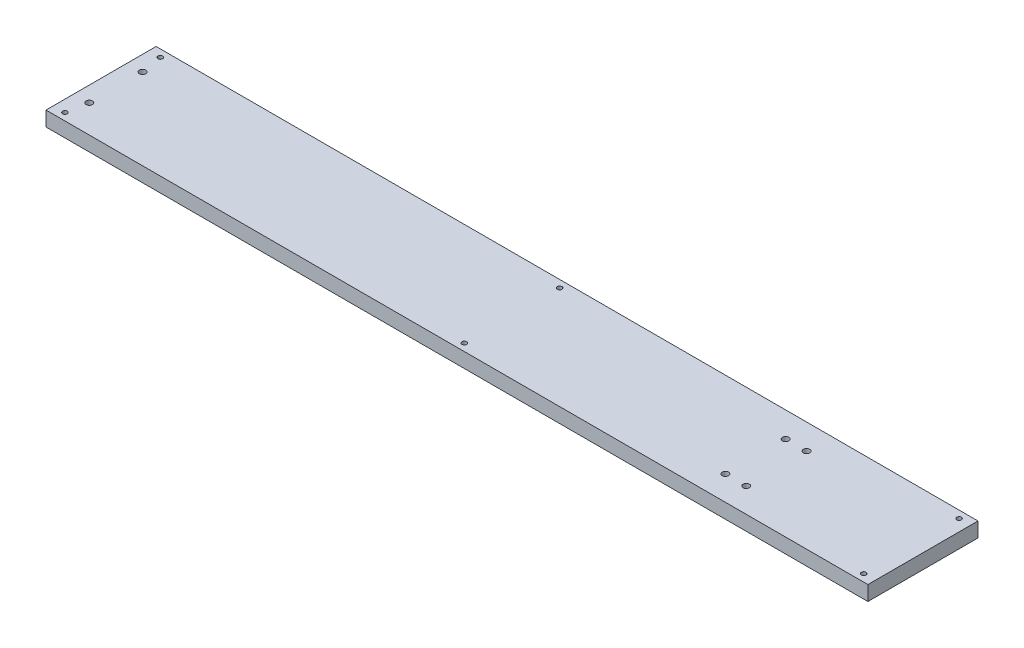
ISO-10303-21;
HEADER;
FILE_DESCRIPTION(('STEP AP214'),'2;1');
FILE_NAME('part.step','',(''),(''),'','','');
FILE_SCHEMA(('AUTOMOTIVE_DESIGN { 1 0 10303 214 1 1 1 1 }'));
ENDSEC;
DATA;
#1=APPLICATION_CONTEXT('core data for automotive mechanical design processes');
#2=APPLICATION_PROTOCOL_DEFINITION('international standard','automotive_design',2000,#1);
#3=PRODUCT_CONTEXT('',#1,'mechanical');
#4=PRODUCT('Part','Part','',(#3));
#5=PRODUCT_RELATED_PRODUCT_CATEGORY('part','',(#4));
#6=PRODUCT_DEFINITION_FORMATION('','',#4);
#7=PRODUCT_DEFINITION_CONTEXT('part definition',#1,'design');
#8=PRODUCT_DEFINITION('design','',#6,#7);
#9=PRODUCT_DEFINITION_SHAPE('','',#8);
#10=(LENGTH_UNIT() NAMED_UNIT(*) SI_UNIT(.MILLI.,.METRE.));
#11=(NAMED_UNIT(*) PLANE_ANGLE_UNIT() SI_UNIT($,.RADIAN.));
#12=(NAMED_UNIT(*) SI_UNIT($,.STERADIAN.) SOLID_ANGLE_UNIT());
#13=UNCERTAINTY_MEASURE_WITH_UNIT(LENGTH_MEASURE(1.E-05),#10,'distance_accuracy_value','');
#14=(GEOMETRIC_REPRESENTATION_CONTEXT(3) GLOBAL_UNCERTAINTY_ASSIGNED_CONTEXT((#13)) GLOBAL_UNIT_ASSIGNED_CONTEXT((#10,
#11,#12)) REPRESENTATION_CONTEXT('',''));
#15=CARTESIAN_POINT('',(0.,0.,0.));
#16=DIRECTION('',(0.,0.,1.));
#17=DIRECTION('',(1.,0.,0.));
#18=AXIS2_PLACEMENT_3D('',#15,#16,#17);
#19=CARTESIAN_POINT('',(0.,12.7,0.));
#20=DIRECTION('',(1.,0.,0.));
#21=DIRECTION('',(0.,0.,-1.));
#22=AXIS2_PLACEMENT_3D('',#19,#20,#21);
#23=PLANE('',#22);
#24=DIRECTION('',(0.,0.,1.));
#25=VECTOR('',#24,1.);
#26=CARTESIAN_POINT('',(0.,0.,0.));
#27=LINE('',#26,#25);
#28=CARTESIAN_POINT('',(0.,0.,-95.));
#29=VERTEX_POINT('',#28);
#30=CARTESIAN_POINT('',(0.,0.,0.));
#31=VERTEX_POINT('',#30);
#32=EDGE_CURVE('E112',#29,#31,#27,.T.);
#33=ORIENTED_EDGE('',*,*,#32,.T.);
#34=DIRECTION('',(0.,-1.,0.));
#35=VECTOR('',#34,1.);
#36=CARTESIAN_POINT('',(0.,12.7,0.));
#37=LINE('',#36,#35);
#38=CARTESIAN_POINT('',(0.,12.7,0.));
#39=VERTEX_POINT('',#38);
#40=EDGE_CURVE('E11',#39,#31,#37,.T.);
#41=ORIENTED_EDGE('',*,*,#40,.F.);
#42=DIRECTION('',(0.,0.,1.));
#43=VECTOR('',#42,1.);
#44=CARTESIAN_POINT('',(0.,12.7,0.));
#45=LINE('',#44,#43);
#46=CARTESIAN_POINT('',(0.,12.7,-95.));
#47=VERTEX_POINT('',#46);
#48=EDGE_CURVE('E96',#47,#39,#45,.T.);
#49=ORIENTED_EDGE('',*,*,#48,.F.);
#50=DIRECTION('',(0.,-1.,0.));
#51=VECTOR('',#50,1.);
#52=CARTESIAN_POINT('',(0.,12.7,-95.));
#53=LINE('',#52,#51);
#54=EDGE_CURVE('E108',#47,#29,#53,.T.);
#55=ORIENTED_EDGE('',*,*,#54,.T.);
#56=EDGE_LOOP('',(#33,#41,#49,#55));
#57=FACE_BOUND('',#56,.T.);
#58=ADVANCED_FACE('F44',(#57),#23,.F.);
#59=CARTESIAN_POINT('',(0.,12.7,0.));
#60=DIRECTION('',(0.,0.,-1.));
#61=DIRECTION('',(-1.,0.,0.));
#62=AXIS2_PLACEMENT_3D('',#59,#60,#61);
#63=PLANE('',#62);
#64=DIRECTION('',(1.,0.,0.));
#65=VECTOR('',#64,1.);
#66=CARTESIAN_POINT('',(0.,0.,0.));
#67=LINE('',#66,#65);
#68=CARTESIAN_POINT('',(709.,0.,0.));
#69=VERTEX_POINT('',#68);
#70=EDGE_CURVE('E101',#31,#69,#67,.T.);
#71=ORIENTED_EDGE('',*,*,#70,.T.);
#72=DIRECTION('',(0.,-1.,0.));
#73=VECTOR('',#72,1.);
#74=CARTESIAN_POINT('',(709.,12.7,0.));
#75=LINE('',#74,#73);
#76=CARTESIAN_POINT('',(709.,12.7,0.));
#77=VERTEX_POINT('',#76);
#78=EDGE_CURVE('E53',#77,#69,#75,.T.);
#79=ORIENTED_EDGE('',*,*,#78,.F.);
#80=DIRECTION('',(1.,0.,0.));
#81=VECTOR('',#80,1.);
#82=CARTESIAN_POINT('',(0.,12.7,0.));
#83=LINE('',#82,#81);
#84=EDGE_CURVE('E91',#39,#77,#83,.T.);
#85=ORIENTED_EDGE('',*,*,#84,.F.);
#86=ORIENTED_EDGE('',*,*,#40,.T.);
#87=EDGE_LOOP('',(#71,#79,#85,#86));
#88=FACE_BOUND('',#87,.T.);
#89=ADVANCED_FACE('F100',(#88),#63,.F.);
#90=CARTESIAN_POINT('',(709.,12.7,0.));
#91=DIRECTION('',(-1.,0.,0.));
#92=DIRECTION('',(0.,0.,1.));
#93=AXIS2_PLACEMENT_3D('',#90,#91,#92);
#94=PLANE('',#93);
#95=DIRECTION('',(0.,0.,-1.));
#96=VECTOR('',#95,1.);
#97=CARTESIAN_POINT('',(709.,0.,0.));
#98=LINE('',#97,#96);
#99=CARTESIAN_POINT('',(709.,0.,-95.));
#100=VERTEX_POINT('',#99);
#101=EDGE_CURVE('E78',#69,#100,#98,.T.);
#102=ORIENTED_EDGE('',*,*,#101,.T.);
#103=DIRECTION('',(0.,-1.,0.));
#104=VECTOR('',#103,1.);
#105=CARTESIAN_POINT('',(709.,12.7,-95.));
#106=LINE('',#105,#104);
#107=CARTESIAN_POINT('',(709.,12.7,-95.));
#108=VERTEX_POINT('',#107);
#109=EDGE_CURVE('E103',#108,#100,#106,.T.);
#110=ORIENTED_EDGE('',*,*,#109,.F.);
#111=DIRECTION('',(0.,0.,-1.));
#112=VECTOR('',#111,1.);
#113=CARTESIAN_POINT('',(709.,12.7,0.));
#114=LINE('',#113,#112);
#115=EDGE_CURVE('E94',#77,#108,#114,.T.);
#116=ORIENTED_EDGE('',*,*,#115,.F.);
#117=ORIENTED_EDGE('',*,*,#78,.T.);
#118=EDGE_LOOP('',(#102,#110,#116,#117));
#119=FACE_BOUND('',#118,.T.);
#120=ADVANCED_FACE('F104',(#119),#94,.F.);
#121=CARTESIAN_POINT('',(0.,12.7,-95.));
#122=DIRECTION('',(0.,0.,1.));
#123=DIRECTION('',(1.,0.,0.));
#124=AXIS2_PLACEMENT_3D('',#121,#122,#123);
#125=PLANE('',#124);
#126=DIRECTION('',(-1.,0.,0.));
#127=VECTOR('',#126,1.);
#128=CARTESIAN_POINT('',(0.,0.,-95.));
#129=LINE('',#128,#127);
#130=EDGE_CURVE('E84',#100,#29,#129,.T.);
#131=ORIENTED_EDGE('',*,*,#130,.T.);
#132=ORIENTED_EDGE('',*,*,#54,.F.);
#133=DIRECTION('',(-1.,0.,0.));
#134=VECTOR('',#133,1.);
#135=CARTESIAN_POINT('',(0.,12.7,-95.));
#136=LINE('',#135,#134);
#137=EDGE_CURVE('E61',#108,#47,#136,.T.);
#138=ORIENTED_EDGE('',*,*,#137,.F.);
#139=ORIENTED_EDGE('',*,*,#109,.T.);
#140=EDGE_LOOP('',(#131,#132,#138,#139));
#141=FACE_BOUND('',#140,.T.);
#142=ADVANCED_FACE('F126',(#141),#125,.F.);
#143=CARTESIAN_POINT('',(0.,12.7,0.));
#144=DIRECTION('',(0.,-1.,0.));
#145=DIRECTION('',(0.,0.,-1.));
#146=AXIS2_PLACEMENT_3D('',#143,#144,#145);
#147=PLANE('',#146);
#148=CARTESIAN_POINT('',(13.208,12.7,-24.13));
#149=DIRECTION('',(0.,-1.,0.));
#150=DIRECTION('',(0.,0.,-1.));
#151=AXIS2_PLACEMENT_3D('',#148,#149,#150);
#152=CIRCLE('',#151,2.75);
#153=CARTESIAN_POINT('',(13.208,12.7,-26.88));
#154=VERTEX_POINT('',#153);
#155=EDGE_CURVE('E194',#154,#154,#152,.T.);
#156=ORIENTED_EDGE('',*,*,#155,.T.);
#157=EDGE_LOOP('',(#156));
#158=FACE_BOUND('',#157,.T.);
#159=CARTESIAN_POINT('',(13.208,12.7,-70.108));
#160=DIRECTION('',(0.,-1.,0.));
#161=DIRECTION('',(0.,0.,-1.));
#162=AXIS2_PLACEMENT_3D('',#159,#160,#161);
#163=CIRCLE('',#162,2.75);
#164=CARTESIAN_POINT('',(13.208,12.7,-72.858));
#165=VERTEX_POINT('',#164);
#166=EDGE_CURVE('E213',#165,#165,#163,.T.);
#167=ORIENTED_EDGE('',*,*,#166,.T.);
#168=EDGE_LOOP('',(#167));
#169=FACE_BOUND('',#168,.T.);
#170=CARTESIAN_POINT('',(582.856967805999,12.7,-73.2158));
#171=DIRECTION('',(0.,-1.,0.));
#172=DIRECTION('',(0.,0.,-1.));
#173=AXIS2_PLACEMENT_3D('',#170,#171,#172);
#174=CIRCLE('',#173,2.75000000000004);
#175=CARTESIAN_POINT('',(582.856967805999,12.7,-75.9658));
#176=VERTEX_POINT('',#175);
#177=EDGE_CURVE('E189',#176,#176,#174,.T.);
#178=ORIENTED_EDGE('',*,*,#177,.T.);
#179=EDGE_LOOP('',(#178));
#180=FACE_BOUND('',#179,.T.);
#181=CARTESIAN_POINT('',(564.856967805999,12.7,-73.2158000000014));
#182=DIRECTION('',(0.,-1.,0.));
#183=DIRECTION('',(0.,0.,-1.));
#184=AXIS2_PLACEMENT_3D('',#181,#182,#183);
#185=CIRCLE('',#184,2.75000000000004);
#186=CARTESIAN_POINT('',(564.856967805999,12.7,-75.9658000000014));
#187=VERTEX_POINT('',#186);
#188=EDGE_CURVE('E198',#187,#187,#185,.T.);
#189=ORIENTED_EDGE('',*,*,#188,.T.);
#190=EDGE_LOOP('',(#189));
#191=FACE_BOUND('',#190,.T.);
#192=CARTESIAN_POINT('',(564.856967805994,12.7,-21.2158000000001));
#193=DIRECTION('',(0.,-1.,0.));
#194=DIRECTION('',(0.,0.,-1.));
#195=AXIS2_PLACEMENT_3D('',#192,#193,#194);
#196=CIRCLE('',#195,2.75000000000004);
#197=CARTESIAN_POINT('',(564.856967805994,12.7,-23.9658000000002));
#198=VERTEX_POINT('',#197);
#199=EDGE_CURVE('E206',#198,#198,#196,.T.);
#200=ORIENTED_EDGE('',*,*,#199,.T.);
#201=EDGE_LOOP('',(#200));
#202=FACE_BOUND('',#201,.T.);
#203=CARTESIAN_POINT('',(582.856967805994,12.7,-21.2158));
#204=DIRECTION('',(0.,-1.,0.));
#205=DIRECTION('',(0.,0.,-1.));
#206=AXIS2_PLACEMENT_3D('',#203,#204,#205);
#207=CIRCLE('',#206,2.75000000000004);
#208=CARTESIAN_POINT('',(582.856967805994,12.7,-23.9658));
#209=VERTEX_POINT('',#208);
#210=EDGE_CURVE('E146',#209,#209,#207,.T.);
#211=ORIENTED_EDGE('',*,*,#210,.T.);
#212=EDGE_LOOP('',(#211));
#213=FACE_BOUND('',#212,.T.);
#214=CARTESIAN_POINT('',(10.,12.7,-6.35));
#215=DIRECTION('',(0.,-1.,0.));
#216=DIRECTION('',(0.,0.,-1.));
#217=AXIS2_PLACEMENT_3D('',#214,#215,#216);
#218=CIRCLE('',#217,2.01949999999999);
#219=CARTESIAN_POINT('',(10.,12.7,-8.36949999999999));
#220=VERTEX_POINT('',#219);
#221=EDGE_CURVE('E141',#220,#220,#218,.T.);
#222=ORIENTED_EDGE('',*,*,#221,.T.);
#223=EDGE_LOOP('',(#222));
#224=FACE_BOUND('',#223,.T.);
#225=CARTESIAN_POINT('',(354.5,12.7,-6.35));
#226=DIRECTION('',(0.,-1.,0.));
#227=DIRECTION('',(0.,0.,-1.));
#228=AXIS2_PLACEMENT_3D('',#225,#226,#227);
#229=CIRCLE('',#228,2.01950000000003);
#230=CARTESIAN_POINT('',(354.5,12.7,-8.36950000000003));
#231=VERTEX_POINT('',#230);
#232=EDGE_CURVE('E150',#231,#231,#229,.T.);
#233=ORIENTED_EDGE('',*,*,#232,.T.);
#234=EDGE_LOOP('',(#233));
#235=FACE_BOUND('',#234,.T.);
#236=CARTESIAN_POINT('',(699.,12.7,-6.35));
#237=DIRECTION('',(0.,-1.,0.));
#238=DIRECTION('',(0.,0.,-1.));
#239=AXIS2_PLACEMENT_3D('',#236,#237,#238);
#240=CIRCLE('',#239,2.01949999999992);
#241=CARTESIAN_POINT('',(699.,12.7,-8.36949999999992));
#242=VERTEX_POINT('',#241);
#243=EDGE_CURVE('E158',#242,#242,#240,.T.);
#244=ORIENTED_EDGE('',*,*,#243,.T.);
#245=EDGE_LOOP('',(#244));
#246=FACE_BOUND('',#245,.T.);
#247=CARTESIAN_POINT('',(699.,12.7,-88.65));
#248=DIRECTION('',(0.,-1.,0.));
#249=DIRECTION('',(0.,0.,-1.));
#250=AXIS2_PLACEMENT_3D('',#247,#248,#249);
#251=CIRCLE('',#250,2.01949999999992);
#252=CARTESIAN_POINT('',(699.,12.7,-90.6694999999999));
#253=VERTEX_POINT('',#252);
#254=EDGE_CURVE('E166',#253,#253,#251,.T.);
#255=ORIENTED_EDGE('',*,*,#254,.T.);
#256=EDGE_LOOP('',(#255));
#257=FACE_BOUND('',#256,.T.);
#258=CARTESIAN_POINT('',(354.5,12.7,-88.65));
#259=DIRECTION('',(0.,-1.,0.));
#260=DIRECTION('',(0.,0.,-1.));
#261=AXIS2_PLACEMENT_3D('',#258,#259,#260);
#262=CIRCLE('',#261,2.01950000000003);
#263=CARTESIAN_POINT('',(354.5,12.7,-90.6695000000001));
#264=VERTEX_POINT('',#263);
#265=EDGE_CURVE('E174',#264,#264,#262,.T.);
#266=ORIENTED_EDGE('',*,*,#265,.T.);
#267=EDGE_LOOP('',(#266));
#268=FACE_BOUND('',#267,.T.);
#269=CARTESIAN_POINT('',(10.,12.7,-88.6500000000001));
#270=DIRECTION('',(0.,-1.,0.));
#271=DIRECTION('',(0.,0.,-1.));
#272=AXIS2_PLACEMENT_3D('',#269,#270,#271);
#273=CIRCLE('',#272,2.0195);
#274=CARTESIAN_POINT('',(10.,12.7,-90.6695000000001));
#275=VERTEX_POINT('',#274);
#276=EDGE_CURVE('E116',#275,#275,#273,.T.);
#277=ORIENTED_EDGE('',*,*,#276,.T.);
#278=EDGE_LOOP('',(#277));
#279=FACE_BOUND('',#278,.T.);
#280=ORIENTED_EDGE('',*,*,#48,.T.);
#281=ORIENTED_EDGE('',*,*,#84,.T.);
#282=ORIENTED_EDGE('',*,*,#115,.T.);
#283=ORIENTED_EDGE('',*,*,#137,.T.);
#284=EDGE_LOOP('',(#280,#281,#282,#283));
#285=FACE_BOUND('',#284,.T.);
#286=ADVANCED_FACE('F92',(#158,#169,#180,#191,#202,#213,#224,#235,#246,#257,#268,#279,#285),
#147,.F.);
#287=CARTESIAN_POINT('',(0.,0.,0.));
#288=DIRECTION('',(0.,-1.,0.));
#289=DIRECTION('',(0.,0.,-1.));
#290=AXIS2_PLACEMENT_3D('',#287,#288,#289);
#291=PLANE('',#290);
#292=CARTESIAN_POINT('',(13.208,0.,-24.13));
#293=DIRECTION('',(0.,-1.,0.));
#294=DIRECTION('',(0.,0.,-1.));
#295=AXIS2_PLACEMENT_3D('',#292,#293,#294);
#296=CIRCLE('',#295,2.75);
#297=CARTESIAN_POINT('',(13.208,0.,-26.88));
#298=VERTEX_POINT('',#297);
#299=EDGE_CURVE('E221',#298,#298,#296,.T.);
#300=ORIENTED_EDGE('',*,*,#299,.F.);
#301=EDGE_LOOP('',(#300));
#302=FACE_BOUND('',#301,.T.);
#303=CARTESIAN_POINT('',(13.208,0.,-70.108));
#304=DIRECTION('',(0.,-1.,0.));
#305=DIRECTION('',(0.,0.,-1.));
#306=AXIS2_PLACEMENT_3D('',#303,#304,#305);
#307=CIRCLE('',#306,2.75);
#308=CARTESIAN_POINT('',(13.208,0.,-72.858));
#309=VERTEX_POINT('',#308);
#310=EDGE_CURVE('E217',#309,#309,#307,.T.);
#311=ORIENTED_EDGE('',*,*,#310,.F.);
#312=EDGE_LOOP('',(#311));
#313=FACE_BOUND('',#312,.T.);
#314=CARTESIAN_POINT('',(582.856967805999,0.,-73.2158));
#315=DIRECTION('',(0.,-1.,0.));
#316=DIRECTION('',(0.,0.,-1.));
#317=AXIS2_PLACEMENT_3D('',#314,#315,#316);
#318=CIRCLE('',#317,2.75000000000004);
#319=CARTESIAN_POINT('',(582.856967805999,0.,-75.9658));
#320=VERTEX_POINT('',#319);
#321=EDGE_CURVE('E193',#320,#320,#318,.T.);
#322=ORIENTED_EDGE('',*,*,#321,.F.);
#323=EDGE_LOOP('',(#322));
#324=FACE_BOUND('',#323,.T.);
#325=CARTESIAN_POINT('',(564.856967805999,0.,-73.2158000000014));
#326=DIRECTION('',(0.,-1.,0.));
#327=DIRECTION('',(0.,0.,-1.));
#328=AXIS2_PLACEMENT_3D('',#325,#326,#327);
#329=CIRCLE('',#328,2.75000000000004);
#330=CARTESIAN_POINT('',(564.856967805999,0.,-75.9658000000014));
#331=VERTEX_POINT('',#330);
#332=EDGE_CURVE('E202',#331,#331,#329,.T.);
#333=ORIENTED_EDGE('',*,*,#332,.F.);
#334=EDGE_LOOP('',(#333));
#335=FACE_BOUND('',#334,.T.);
#336=CARTESIAN_POINT('',(564.856967805994,0.,-21.2158000000001));
#337=DIRECTION('',(0.,-1.,0.));
#338=DIRECTION('',(0.,0.,-1.));
#339=AXIS2_PLACEMENT_3D('',#336,#337,#338);
#340=CIRCLE('',#339,2.75000000000004);
#341=CARTESIAN_POINT('',(564.856967805994,0.,-23.9658000000002));
#342=VERTEX_POINT('',#341);
#343=EDGE_CURVE('E185',#342,#342,#340,.T.);
#344=ORIENTED_EDGE('',*,*,#343,.F.);
#345=EDGE_LOOP('',(#344));
#346=FACE_BOUND('',#345,.T.);
#347=CARTESIAN_POINT('',(582.856967805994,0.,-21.2158));
#348=DIRECTION('',(0.,-1.,0.));
#349=DIRECTION('',(0.,0.,-1.));
#350=AXIS2_PLACEMENT_3D('',#347,#348,#349);
#351=CIRCLE('',#350,2.75000000000004);
#352=CARTESIAN_POINT('',(582.856967805994,0.,-23.9658));
#353=VERTEX_POINT('',#352);
#354=EDGE_CURVE('E181',#353,#353,#351,.T.);
#355=ORIENTED_EDGE('',*,*,#354,.F.);
#356=EDGE_LOOP('',(#355));
#357=FACE_BOUND('',#356,.T.);
#358=CARTESIAN_POINT('',(10.,0.,-6.35));
#359=DIRECTION('',(0.,-1.,0.));
#360=DIRECTION('',(0.,0.,-1.));
#361=AXIS2_PLACEMENT_3D('',#358,#359,#360);
#362=CIRCLE('',#361,2.01949999999999);
#363=CARTESIAN_POINT('',(10.,0.,-8.36949999999999));
#364=VERTEX_POINT('',#363);
#365=EDGE_CURVE('E145',#364,#364,#362,.T.);
#366=ORIENTED_EDGE('',*,*,#365,.F.);
#367=EDGE_LOOP('',(#366));
#368=FACE_BOUND('',#367,.T.);
#369=CARTESIAN_POINT('',(354.5,0.,-6.35));
#370=DIRECTION('',(0.,-1.,0.));
#371=DIRECTION('',(0.,0.,-1.));
#372=AXIS2_PLACEMENT_3D('',#369,#370,#371);
#373=CIRCLE('',#372,2.01950000000003);
#374=CARTESIAN_POINT('',(354.5,0.,-8.36950000000003));
#375=VERTEX_POINT('',#374);
#376=EDGE_CURVE('E154',#375,#375,#373,.T.);
#377=ORIENTED_EDGE('',*,*,#376,.F.);
#378=EDGE_LOOP('',(#377));
#379=FACE_BOUND('',#378,.T.);
#380=CARTESIAN_POINT('',(699.,0.,-6.35));
#381=DIRECTION('',(0.,-1.,0.));
#382=DIRECTION('',(0.,0.,-1.));
#383=AXIS2_PLACEMENT_3D('',#380,#381,#382);
#384=CIRCLE('',#383,2.01949999999992);
#385=CARTESIAN_POINT('',(699.,0.,-8.36949999999992));
#386=VERTEX_POINT('',#385);
#387=EDGE_CURVE('E162',#386,#386,#384,.T.);
#388=ORIENTED_EDGE('',*,*,#387,.F.);
#389=EDGE_LOOP('',(#388));
#390=FACE_BOUND('',#389,.T.);
#391=CARTESIAN_POINT('',(699.,0.,-88.65));
#392=DIRECTION('',(0.,-1.,0.));
#393=DIRECTION('',(0.,0.,-1.));
#394=AXIS2_PLACEMENT_3D('',#391,#392,#393);
#395=CIRCLE('',#394,2.01949999999992);
#396=CARTESIAN_POINT('',(699.,0.,-90.6694999999999));
#397=VERTEX_POINT('',#396);
#398=EDGE_CURVE('E170',#397,#397,#395,.T.);
#399=ORIENTED_EDGE('',*,*,#398,.F.);
#400=EDGE_LOOP('',(#399));
#401=FACE_BOUND('',#400,.T.);
#402=CARTESIAN_POINT('',(354.5,0.,-88.65));
#403=DIRECTION('',(0.,-1.,0.));
#404=DIRECTION('',(0.,0.,-1.));
#405=AXIS2_PLACEMENT_3D('',#402,#403,#404);
#406=CIRCLE('',#405,2.01950000000003);
#407=CARTESIAN_POINT('',(354.5,0.,-90.6695000000001));
#408=VERTEX_POINT('',#407);
#409=EDGE_CURVE('E137',#408,#408,#406,.T.);
#410=ORIENTED_EDGE('',*,*,#409,.F.);
#411=EDGE_LOOP('',(#410));
#412=FACE_BOUND('',#411,.T.);
#413=CARTESIAN_POINT('',(10.,0.,-88.6500000000001));
#414=DIRECTION('',(0.,-1.,0.));
#415=DIRECTION('',(0.,0.,-1.));
#416=AXIS2_PLACEMENT_3D('',#413,#414,#415);
#417=CIRCLE('',#416,2.0195);
#418=CARTESIAN_POINT('',(10.,0.,-90.6695000000001));
#419=VERTEX_POINT('',#418);
#420=EDGE_CURVE('E133',#419,#419,#417,.T.);
#421=ORIENTED_EDGE('',*,*,#420,.F.);
#422=EDGE_LOOP('',(#421));
#423=FACE_BOUND('',#422,.T.);
#424=ORIENTED_EDGE('',*,*,#32,.F.);
#425=ORIENTED_EDGE('',*,*,#130,.F.);
#426=ORIENTED_EDGE('',*,*,#101,.F.);
#427=ORIENTED_EDGE('',*,*,#70,.F.);
#428=EDGE_LOOP('',(#424,#425,#426,#427));
#429=FACE_BOUND('',#428,.T.);
#430=ADVANCED_FACE('F129',(#302,#313,#324,#335,#346,#357,#368,#379,#390,#401,#412,#423,#429),
#291,.T.);
#431=CARTESIAN_POINT('',(10.,12.7,-88.6500000000001));
#432=DIRECTION('',(0.,-1.,0.));
#433=DIRECTION('',(0.,0.,-1.));
#434=AXIS2_PLACEMENT_3D('',#431,#432,#433);
#435=CYLINDRICAL_SURFACE('',#434,2.0195);
#436=ORIENTED_EDGE('',*,*,#276,.F.);
#437=EDGE_LOOP('',(#436));
#438=FACE_BOUND('',#437,.T.);
#439=ORIENTED_EDGE('',*,*,#420,.T.);
#440=EDGE_LOOP('',(#439));
#441=FACE_BOUND('',#440,.T.);
#442=ADVANCED_FACE('F240',(#438,#441),#435,.F.);
#443=CARTESIAN_POINT('',(354.5,12.7,-88.65));
#444=DIRECTION('',(0.,-1.,0.));
#445=DIRECTION('',(0.,0.,-1.));
#446=AXIS2_PLACEMENT_3D('',#443,#444,#445);
#447=CYLINDRICAL_SURFACE('',#446,2.01950000000003);
#448=ORIENTED_EDGE('',*,*,#265,.F.);
#449=EDGE_LOOP('',(#448));
#450=FACE_BOUND('',#449,.T.);
#451=ORIENTED_EDGE('',*,*,#409,.T.);
#452=EDGE_LOOP('',(#451));
#453=FACE_BOUND('',#452,.T.);
#454=ADVANCED_FACE('F265',(#450,#453),#447,.F.);
#455=CARTESIAN_POINT('',(699.,12.7,-88.65));
#456=DIRECTION('',(0.,-1.,0.));
#457=DIRECTION('',(0.,0.,-1.));
#458=AXIS2_PLACEMENT_3D('',#455,#456,#457);
#459=CYLINDRICAL_SURFACE('',#458,2.01949999999992);
#460=ORIENTED_EDGE('',*,*,#254,.F.);
#461=EDGE_LOOP('',(#460));
#462=FACE_BOUND('',#461,.T.);
#463=ORIENTED_EDGE('',*,*,#398,.T.);
#464=EDGE_LOOP('',(#463));
#465=FACE_BOUND('',#464,.T.);
#466=ADVANCED_FACE('F272',(#462,#465),#459,.F.);
#467=CARTESIAN_POINT('',(699.,12.7,-6.35));
#468=DIRECTION('',(0.,-1.,0.));
#469=DIRECTION('',(0.,0.,-1.));
#470=AXIS2_PLACEMENT_3D('',#467,#468,#469);
#471=CYLINDRICAL_SURFACE('',#470,2.01949999999992);
#472=ORIENTED_EDGE('',*,*,#243,.F.);
#473=EDGE_LOOP('',(#472));
#474=FACE_BOUND('',#473,.T.);
#475=ORIENTED_EDGE('',*,*,#387,.T.);
#476=EDGE_LOOP('',(#475));
#477=FACE_BOUND('',#476,.T.);
#478=ADVANCED_FACE('F365',(#474,#477),#471,.F.);
#479=CARTESIAN_POINT('',(354.5,12.7,-6.35));
#480=DIRECTION('',(0.,-1.,0.));
#481=DIRECTION('',(0.,0.,-1.));
#482=AXIS2_PLACEMENT_3D('',#479,#480,#481);
#483=CYLINDRICAL_SURFACE('',#482,2.01950000000003);
#484=ORIENTED_EDGE('',*,*,#232,.F.);
#485=EDGE_LOOP('',(#484));
#486=FACE_BOUND('',#485,.T.);
#487=ORIENTED_EDGE('',*,*,#376,.T.);
#488=EDGE_LOOP('',(#487));
#489=FACE_BOUND('',#488,.T.);
#490=ADVANCED_FACE('F357',(#486,#489),#483,.F.);
#491=CARTESIAN_POINT('',(10.,12.7,-6.35));
#492=DIRECTION('',(0.,-1.,0.));
#493=DIRECTION('',(0.,0.,-1.));
#494=AXIS2_PLACEMENT_3D('',#491,#492,#493);
#495=CYLINDRICAL_SURFACE('',#494,2.01949999999999);
#496=ORIENTED_EDGE('',*,*,#221,.F.);
#497=EDGE_LOOP('',(#496));
#498=FACE_BOUND('',#497,.T.);
#499=ORIENTED_EDGE('',*,*,#365,.T.);
#500=EDGE_LOOP('',(#499));
#501=FACE_BOUND('',#500,.T.);
#502=ADVANCED_FACE('F348',(#498,#501),#495,.F.);
#503=CARTESIAN_POINT('',(582.856967805994,12.7,-21.2158));
#504=DIRECTION('',(0.,-1.,0.));
#505=DIRECTION('',(0.,0.,-1.));
#506=AXIS2_PLACEMENT_3D('',#503,#504,#505);
#507=CYLINDRICAL_SURFACE('',#506,2.75000000000004);
#508=ORIENTED_EDGE('',*,*,#210,.F.);
#509=EDGE_LOOP('',(#508));
#510=FACE_BOUND('',#509,.T.);
#511=ORIENTED_EDGE('',*,*,#354,.T.);
#512=EDGE_LOOP('',(#511));
#513=FACE_BOUND('',#512,.T.);
#514=ADVANCED_FACE('F339',(#510,#513),#507,.F.);
#515=CARTESIAN_POINT('',(564.856967805994,12.7,-21.2158000000001));
#516=DIRECTION('',(0.,-1.,0.));
#517=DIRECTION('',(0.,0.,-1.));
#518=AXIS2_PLACEMENT_3D('',#515,#516,#517);
#519=CYLINDRICAL_SURFACE('',#518,2.75000000000004);
#520=ORIENTED_EDGE('',*,*,#199,.F.);
#521=EDGE_LOOP('',(#520));
#522=FACE_BOUND('',#521,.T.);
#523=ORIENTED_EDGE('',*,*,#343,.T.);
#524=EDGE_LOOP('',(#523));
#525=FACE_BOUND('',#524,.T.);
#526=ADVANCED_FACE('F330',(#522,#525),#519,.F.);
#527=CARTESIAN_POINT('',(564.856967805999,12.7,-73.2158000000014));
#528=DIRECTION('',(0.,-1.,0.));
#529=DIRECTION('',(0.,0.,-1.));
#530=AXIS2_PLACEMENT_3D('',#527,#528,#529);
#531=CYLINDRICAL_SURFACE('',#530,2.75000000000004);
#532=ORIENTED_EDGE('',*,*,#188,.F.);
#533=EDGE_LOOP('',(#532));
#534=FACE_BOUND('',#533,.T.);
#535=ORIENTED_EDGE('',*,*,#332,.T.);
#536=EDGE_LOOP('',(#535));
#537=FACE_BOUND('',#536,.T.);
#538=ADVANCED_FACE('F322',(#534,#537),#531,.F.);
#539=CARTESIAN_POINT('',(582.856967805999,12.7,-73.2158));
#540=DIRECTION('',(0.,-1.,0.));
#541=DIRECTION('',(0.,0.,-1.));
#542=AXIS2_PLACEMENT_3D('',#539,#540,#541);
#543=CYLINDRICAL_SURFACE('',#542,2.75000000000004);
#544=ORIENTED_EDGE('',*,*,#177,.F.);
#545=EDGE_LOOP('',(#544));
#546=FACE_BOUND('',#545,.T.);
#547=ORIENTED_EDGE('',*,*,#321,.T.);
#548=EDGE_LOOP('',(#547));
#549=FACE_BOUND('',#548,.T.);
#550=ADVANCED_FACE('F296',(#546,#549),#543,.F.);
#551=CARTESIAN_POINT('',(13.208,12.7,-70.108));
#552=DIRECTION('',(0.,-1.,0.));
#553=DIRECTION('',(0.,0.,-1.));
#554=AXIS2_PLACEMENT_3D('',#551,#552,#553);
#555=CYLINDRICAL_SURFACE('',#554,2.75);
#556=ORIENTED_EDGE('',*,*,#166,.F.);
#557=EDGE_LOOP('',(#556));
#558=FACE_BOUND('',#557,.T.);
#559=ORIENTED_EDGE('',*,*,#310,.T.);
#560=EDGE_LOOP('',(#559));
#561=FACE_BOUND('',#560,.T.);
#562=ADVANCED_FACE('F234',(#558,#561),#555,.F.);
#563=CARTESIAN_POINT('',(13.208,12.7,-24.13));
#564=DIRECTION('',(0.,-1.,0.));
#565=DIRECTION('',(0.,0.,-1.));
#566=AXIS2_PLACEMENT_3D('',#563,#564,#565);
#567=CYLINDRICAL_SURFACE('',#566,2.75);
#568=ORIENTED_EDGE('',*,*,#155,.F.);
#569=EDGE_LOOP('',(#568));
#570=FACE_BOUND('',#569,.T.);
#571=ORIENTED_EDGE('',*,*,#299,.T.);
#572=EDGE_LOOP('',(#571));
#573=FACE_BOUND('',#572,.T.);
#574=ADVANCED_FACE('F231',(#570,#573),#567,.F.);
#575=CLOSED_SHELL('',(#58,#89,#120,#142,#286,#430,#442,#454,#466,#478,#490,#502,#514,#526,#538,
#550,#562,#574));
#576=MANIFOLD_SOLID_BREP('B2',#575);
#577=ADVANCED_BREP_SHAPE_REPRESENTATION('',(#18,#576),#14);
#578=SHAPE_DEFINITION_REPRESENTATION(#9,#577);
ENDSEC;
END-ISO-10303-21;
